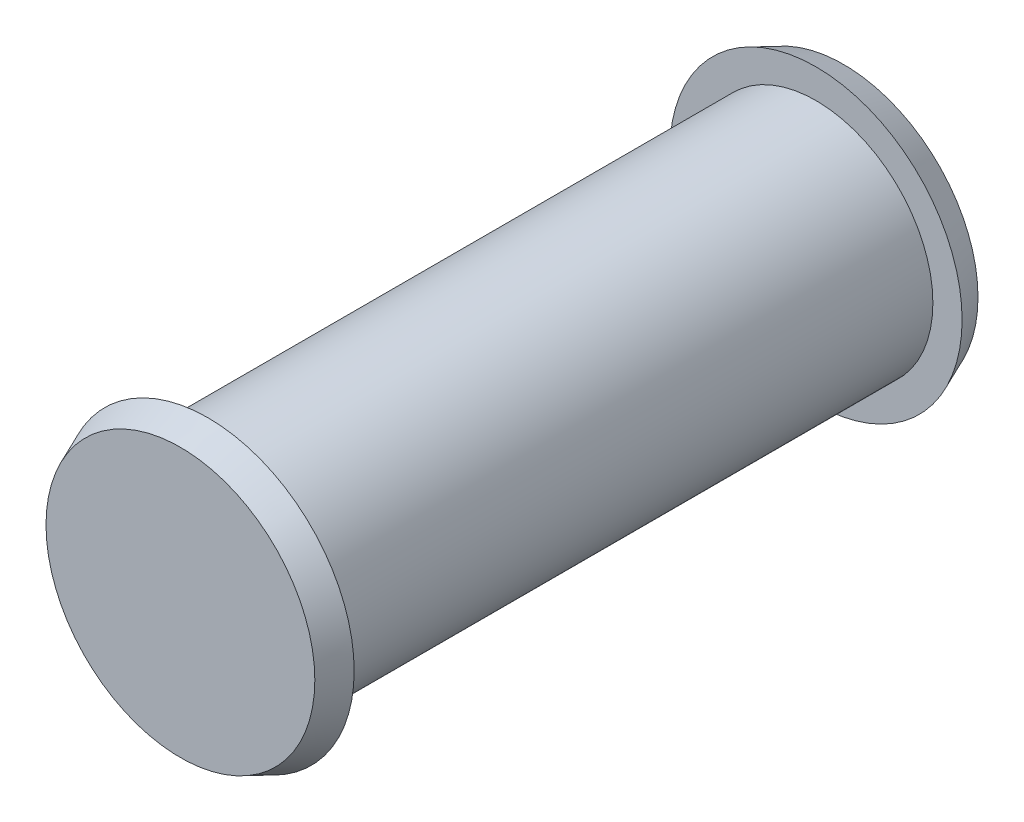
ISO-10303-21;
HEADER;
FILE_DESCRIPTION(('STEP AP214'),'2;1');
FILE_NAME('part.step','',(''),(''),'','','');
FILE_SCHEMA(('AUTOMOTIVE_DESIGN { 1 0 10303 214 1 1 1 1 }'));
ENDSEC;
DATA;
#1=APPLICATION_CONTEXT('core data for automotive mechanical design processes');
#2=APPLICATION_PROTOCOL_DEFINITION('international standard','automotive_design',2000,#1);
#3=PRODUCT_CONTEXT('',#1,'mechanical');
#4=PRODUCT('Part','Part','',(#3));
#5=PRODUCT_RELATED_PRODUCT_CATEGORY('part','',(#4));
#6=PRODUCT_DEFINITION_FORMATION('','',#4);
#7=PRODUCT_DEFINITION_CONTEXT('part definition',#1,'design');
#8=PRODUCT_DEFINITION('design','',#6,#7);
#9=PRODUCT_DEFINITION_SHAPE('','',#8);
#10=(LENGTH_UNIT() NAMED_UNIT(*) SI_UNIT(.MILLI.,.METRE.));
#11=(NAMED_UNIT(*) PLANE_ANGLE_UNIT() SI_UNIT($,.RADIAN.));
#12=(NAMED_UNIT(*) SI_UNIT($,.STERADIAN.) SOLID_ANGLE_UNIT());
#13=UNCERTAINTY_MEASURE_WITH_UNIT(LENGTH_MEASURE(1.E-05),#10,'distance_accuracy_value','');
#14=(GEOMETRIC_REPRESENTATION_CONTEXT(3) GLOBAL_UNCERTAINTY_ASSIGNED_CONTEXT((#13)) GLOBAL_UNIT_ASSIGNED_CONTEXT((#10,
#11,#12)) REPRESENTATION_CONTEXT('',''));
#15=CARTESIAN_POINT('',(0.,0.,0.));
#16=DIRECTION('',(0.,0.,1.));
#17=DIRECTION('',(1.,0.,0.));
#18=AXIS2_PLACEMENT_3D('',#15,#16,#17);
#19=CARTESIAN_POINT('',(-108.082258725157,104.784469074592,-20.3922048969287));
#20=DIRECTION('',(0.,0.,1.));
#21=DIRECTION('',(1.,0.,0.));
#22=AXIS2_PLACEMENT_3D('',#19,#20,#21);
#23=CYLINDRICAL_SURFACE('',#22,2.54000000002594);
#24=CARTESIAN_POINT('',(-108.082258725157,104.784469074592,0.));
#25=DIRECTION('',(0.,0.,1.));
#26=DIRECTION('',(1.,0.,0.));
#27=AXIS2_PLACEMENT_3D('',#24,#25,#26);
#28=CIRCLE('',#27,2.54000000002594);
#29=CARTESIAN_POINT('',(-105.542258725131,104.784469074592,0.));
#30=VERTEX_POINT('',#29);
#31=EDGE_CURVE('E10',#30,#30,#28,.T.);
#32=CARTESIAN_POINT('',(-108.082258725157,104.784469074592,-13.2080000000368));
#33=DIRECTION('',(0.,0.,-1.));
#34=DIRECTION('',(-1.,0.,0.));
#35=AXIS2_PLACEMENT_3D('',#32,#33,#34);
#36=CIRCLE('',#35,2.54000000002594);
#37=CARTESIAN_POINT('',(-105.542258725131,104.784469074592,-13.2080000000368));
#38=VERTEX_POINT('',#37);
#39=EDGE_CURVE('E50',#38,#38,#36,.F.);
#40=CARTESIAN_POINT('',(-105.542258725131,104.784469074592,0.));
#41=CARTESIAN_POINT('',(-105.542258725131,104.784469074592,-0.13758333333372));
#42=CARTESIAN_POINT('',(-105.542258725131,104.784469074592,-0.275166666667436));
#43=CARTESIAN_POINT('',(-105.542258725131,104.784469074592,-0.550333333334868));
#44=CARTESIAN_POINT('',(-105.542258725131,104.784469074592,-0.687916666668584));
#45=CARTESIAN_POINT('',(-105.542258725131,104.784469074592,-0.963083333336017));
#46=CARTESIAN_POINT('',(-105.542258725131,104.784469074592,-1.10066666666973));
#47=CARTESIAN_POINT('',(-105.542258725131,104.784469074592,-1.37583333333717));
#48=CARTESIAN_POINT('',(-105.542258725131,104.784469074592,-1.51341666667088));
#49=CARTESIAN_POINT('',(-105.542258725131,104.784469074592,-1.78858333333832));
#50=CARTESIAN_POINT('',(-105.542258725131,104.784469074592,-1.92616666667203));
#51=CARTESIAN_POINT('',(-105.542258725131,104.784469074592,-2.20133333333946));
#52=CARTESIAN_POINT('',(-105.542258725131,104.784469074592,-2.33891666667318));
#53=CARTESIAN_POINT('',(-105.542258725131,104.784469074592,-2.61408333334061));
#54=CARTESIAN_POINT('',(-105.542258725131,104.784469074592,-2.75166666667433));
#55=CARTESIAN_POINT('',(-105.542258725131,104.784469074592,-3.02683333334176));
#56=CARTESIAN_POINT('',(-105.542258725131,104.784469074592,-3.16441666667548));
#57=CARTESIAN_POINT('',(-105.542258725131,104.784469074592,-3.43958333334291));
#58=CARTESIAN_POINT('',(-105.542258725131,104.784469074592,-3.57716666667663));
#59=CARTESIAN_POINT('',(-105.542258725131,104.784469074592,-3.85233333334406));
#60=CARTESIAN_POINT('',(-105.542258725131,104.784469074592,-3.98991666667778));
#61=CARTESIAN_POINT('',(-105.542258725131,104.784469074592,-4.26508333334521));
#62=CARTESIAN_POINT('',(-105.542258725131,104.784469074592,-4.40266666667893));
#63=CARTESIAN_POINT('',(-105.542258725131,104.784469074592,-4.67783333334636));
#64=CARTESIAN_POINT('',(-105.542258725131,104.784469074592,-4.81541666668008));
#65=CARTESIAN_POINT('',(-105.542258725131,104.784469074592,-5.09058333334751));
#66=CARTESIAN_POINT('',(-105.542258725131,104.784469074592,-5.22816666668122));
#67=CARTESIAN_POINT('',(-105.542258725131,104.784469074592,-5.50333333334866));
#68=CARTESIAN_POINT('',(-105.542258725131,104.784469074592,-5.64091666668237));
#69=CARTESIAN_POINT('',(-105.542258725131,104.784469074592,-5.91608333334981));
#70=CARTESIAN_POINT('',(-105.542258725131,104.784469074592,-6.05366666668352));
#71=CARTESIAN_POINT('',(-105.542258725131,104.784469074592,-6.32883333335096));
#72=CARTESIAN_POINT('',(-105.542258725131,104.784469074592,-6.46641666668467));
#73=CARTESIAN_POINT('',(-105.542258725131,104.784469074592,-6.7415833333521));
#74=CARTESIAN_POINT('',(-105.542258725131,104.784469074592,-6.87916666668582));
#75=CARTESIAN_POINT('',(-105.542258725131,104.784469074592,-7.15433333335325));
#76=CARTESIAN_POINT('',(-105.542258725131,104.784469074592,-7.29191666668697));
#77=CARTESIAN_POINT('',(-105.542258725131,104.784469074592,-7.5670833333544));
#78=CARTESIAN_POINT('',(-105.542258725131,104.784469074592,-7.70466666668812));
#79=CARTESIAN_POINT('',(-105.542258725131,104.784469074592,-7.97983333335555));
#80=CARTESIAN_POINT('',(-105.542258725131,104.784469074592,-8.11741666668927));
#81=CARTESIAN_POINT('',(-105.542258725131,104.784469074592,-8.3925833333567));
#82=CARTESIAN_POINT('',(-105.542258725131,104.784469074592,-8.53016666669042));
#83=CARTESIAN_POINT('',(-105.542258725131,104.784469074592,-8.80533333335785));
#84=CARTESIAN_POINT('',(-105.542258725131,104.784469074592,-8.94291666669156));
#85=CARTESIAN_POINT('',(-105.542258725131,104.784469074592,-9.218083333359));
#86=CARTESIAN_POINT('',(-105.542258725131,104.784469074592,-9.35566666669271));
#87=CARTESIAN_POINT('',(-105.542258725131,104.784469074592,-9.63083333336015));
#88=CARTESIAN_POINT('',(-105.542258725131,104.784469074592,-9.76841666669386));
#89=CARTESIAN_POINT('',(-105.542258725131,104.784469074592,-10.0435833333613));
#90=CARTESIAN_POINT('',(-105.542258725131,104.784469074592,-10.181166666695));
#91=CARTESIAN_POINT('',(-105.542258725131,104.784469074592,-10.4563333333624));
#92=CARTESIAN_POINT('',(-105.542258725131,104.784469074592,-10.5939166666962));
#93=CARTESIAN_POINT('',(-105.542258725131,104.784469074592,-10.8690833333636));
#94=CARTESIAN_POINT('',(-105.542258725131,104.784469074592,-11.0066666666973));
#95=CARTESIAN_POINT('',(-105.542258725131,104.784469074592,-11.2818333333647));
#96=CARTESIAN_POINT('',(-105.542258725131,104.784469074592,-11.4194166666985));
#97=CARTESIAN_POINT('',(-105.542258725131,104.784469074592,-11.6945833333659));
#98=CARTESIAN_POINT('',(-105.542258725131,104.784469074592,-11.8321666666996));
#99=CARTESIAN_POINT('',(-105.542258725131,104.784469074592,-12.107333333367));
#100=CARTESIAN_POINT('',(-105.542258725131,104.784469074592,-12.2449166667008));
#101=CARTESIAN_POINT('',(-105.542258725131,104.784469074592,-12.5200833333682));
#102=CARTESIAN_POINT('',(-105.542258725131,104.784469074592,-12.6576666667019));
#103=CARTESIAN_POINT('',(-105.542258725131,104.784469074592,-12.9328333333693));
#104=CARTESIAN_POINT('',(-105.542258725131,104.784469074592,-13.0704166667031));
#105=CARTESIAN_POINT('',(-105.542258725131,104.784469074592,-13.2080000000368));
#106=B_SPLINE_CURVE_WITH_KNOTS('',3,(#40,#41,#42,#43,#44,#45,#46,#47,#48,#49,#50,#51,#52,#53,
#54,#55,#56,#57,#58,#59,#60,#61,#62,#63,#64,#65,#66,#67,#68,#69,#70,#71,#72,#73,#74,#75,#76,#77,
#78,#79,#80,#81,#82,#83,#84,#85,#86,#87,#88,#89,#90,#91,#92,#93,#94,#95,#96,#97,#98,#99,#100,
#101,#102,#103,#104,#105),.UNSPECIFIED.,.F.,.F.,(4,2,2,2,2,2,2,2,2,2,2,2,2,2,2,2,2,2,2,2,2,2,2,
2,2,2,2,2,2,2,2,2,4),(0.,0.412750000001148,0.825500000002297,1.23825000000345,1.6510000000046,
2.06375000000574,2.47650000000689,2.88925000000805,3.30200000000919,3.71475000001034,
4.12750000001149,4.54025000001264,4.95300000001379,5.36575000001494,5.77850000001609,
6.19125000001724,6.60400000001839,7.01675000001953,7.42950000002068,7.84225000002183,
8.25500000002298,8.66775000002413,9.08050000002528,9.49325000002643,9.90600000002758,
10.3187500000287,10.7315000000299,11.144250000031,11.5570000000322,11.9697500000333,
12.3825000000345,12.7952500000356,13.2080000000368),.UNSPECIFIED.);
#107=EDGE_CURVE('BSEAM36',#30,#38,#106,.T.);
#108=ORIENTED_EDGE('',*,*,#31,.F.);
#109=ORIENTED_EDGE('',*,*,#39,.T.);
#110=ORIENTED_EDGE('',*,*,#107,.T.);
#111=ORIENTED_EDGE('',*,*,#107,.F.);
#112=EDGE_LOOP('',(#108,#110,#109,#111));
#113=FACE_BOUND('',#112,.T.);
#114=ADVANCED_FACE('F36',(#113),#23,.T.);
#115=CARTESIAN_POINT('',(-108.082258725157,104.784469074592,0.));
#116=DIRECTION('',(0.,0.,-1.));
#117=DIRECTION('',(1.,0.,0.));
#118=AXIS2_PLACEMENT_3D('',#115,#116,#117);
#119=CONICAL_SURFACE('',#118,3.175,0.401425727958696);
#120=CARTESIAN_POINT('',(-108.082258725157,104.784469074592,0.6));
#121=DIRECTION('',(0.,0.,1.));
#122=DIRECTION('',(1.,0.,0.));
#123=AXIS2_PLACEMENT_3D('',#120,#121,#122);
#124=CIRCLE('',#123,2.92031511027423);
#125=CARTESIAN_POINT('',(-105.161943614883,104.784469074592,0.6));
#126=VERTEX_POINT('',#125);
#127=EDGE_CURVE('E42',#126,#126,#124,.T.);
#128=ORIENTED_EDGE('',*,*,#127,.F.);
#129=EDGE_LOOP('',(#128));
#130=FACE_BOUND('',#129,.T.);
#131=CARTESIAN_POINT('',(-108.082258725157,104.784469074592,0.));
#132=DIRECTION('',(0.,0.,1.));
#133=DIRECTION('',(1.,0.,0.));
#134=AXIS2_PLACEMENT_3D('',#131,#132,#133);
#135=CIRCLE('',#134,3.175);
#136=CARTESIAN_POINT('',(-104.907258725157,104.784469074592,0.));
#137=VERTEX_POINT('',#136);
#138=EDGE_CURVE('E46',#137,#137,#135,.T.);
#139=ORIENTED_EDGE('',*,*,#138,.T.);
#140=EDGE_LOOP('',(#139));
#141=FACE_BOUND('',#140,.T.);
#142=ADVANCED_FACE('F76',(#130,#141),#119,.T.);
#143=CARTESIAN_POINT('',(-108.082258725157,104.784469074592,0.6));
#144=DIRECTION('',(0.,0.,1.));
#145=DIRECTION('',(1.,0.,0.));
#146=AXIS2_PLACEMENT_3D('',#143,#144,#145);
#147=PLANE('',#146);
#148=ORIENTED_EDGE('',*,*,#127,.T.);
#149=EDGE_LOOP('',(#148));
#150=FACE_BOUND('',#149,.T.);
#151=ADVANCED_FACE('F81',(#150),#147,.T.);
#152=CARTESIAN_POINT('',(-108.082258725157,104.784469074592,0.));
#153=DIRECTION('',(0.,0.,1.));
#154=DIRECTION('',(1.,0.,0.));
#155=AXIS2_PLACEMENT_3D('',#152,#153,#154);
#156=PLANE('',#155);
#157=ORIENTED_EDGE('',*,*,#31,.T.);
#158=EDGE_LOOP('',(#157));
#159=FACE_BOUND('',#158,.T.);
#160=ORIENTED_EDGE('',*,*,#138,.F.);
#161=EDGE_LOOP('',(#160));
#162=FACE_BOUND('',#161,.T.);
#163=ADVANCED_FACE('F87',(#159,#162),#156,.F.);
#164=CARTESIAN_POINT('',(-108.082258725157,104.784469074592,-13.2080000000368));
#165=DIRECTION('',(0.,0.,1.));
#166=DIRECTION('',(-1.,0.,0.));
#167=AXIS2_PLACEMENT_3D('',#164,#165,#166);
#168=CONICAL_SURFACE('',#167,3.175,0.401425727958696);
#169=CARTESIAN_POINT('',(-108.082258725157,104.784469074592,-13.8080000000368));
#170=DIRECTION('',(0.,0.,-1.));
#171=DIRECTION('',(-1.,0.,0.));
#172=AXIS2_PLACEMENT_3D('',#169,#170,#171);
#173=CIRCLE('',#172,2.92031511027423);
#174=CARTESIAN_POINT('',(-111.002573835431,104.784469074592,-13.8080000000368));
#175=VERTEX_POINT('',#174);
#176=EDGE_CURVE('E55',#175,#175,#173,.T.);
#177=ORIENTED_EDGE('',*,*,#176,.F.);
#178=EDGE_LOOP('',(#177));
#179=FACE_BOUND('',#178,.T.);
#180=CARTESIAN_POINT('',(-108.082258725157,104.784469074592,-13.2080000000368));
#181=DIRECTION('',(0.,0.,-1.));
#182=DIRECTION('',(-1.,0.,0.));
#183=AXIS2_PLACEMENT_3D('',#180,#181,#182);
#184=CIRCLE('',#183,3.175);
#185=CARTESIAN_POINT('',(-111.257258725157,104.784469074592,-13.2080000000368));
#186=VERTEX_POINT('',#185);
#187=EDGE_CURVE('E58',#186,#186,#184,.T.);
#188=ORIENTED_EDGE('',*,*,#187,.T.);
#189=EDGE_LOOP('',(#188));
#190=FACE_BOUND('',#189,.T.);
#191=ADVANCED_FACE('F62',(#179,#190),#168,.T.);
#192=CARTESIAN_POINT('',(-108.082258725157,104.784469074592,-13.8080000000368));
#193=DIRECTION('',(0.,0.,-1.));
#194=DIRECTION('',(-1.,0.,0.));
#195=AXIS2_PLACEMENT_3D('',#192,#193,#194);
#196=PLANE('',#195);
#197=ORIENTED_EDGE('',*,*,#176,.T.);
#198=EDGE_LOOP('',(#197));
#199=FACE_BOUND('',#198,.T.);
#200=ADVANCED_FACE('F66',(#199),#196,.T.);
#201=CARTESIAN_POINT('',(-108.082258725157,104.784469074592,-13.2080000000368));
#202=DIRECTION('',(0.,0.,-1.));
#203=DIRECTION('',(-1.,0.,0.));
#204=AXIS2_PLACEMENT_3D('',#201,#202,#203);
#205=PLANE('',#204);
#206=ORIENTED_EDGE('',*,*,#39,.F.);
#207=EDGE_LOOP('',(#206));
#208=FACE_BOUND('',#207,.T.);
#209=ORIENTED_EDGE('',*,*,#187,.F.);
#210=EDGE_LOOP('',(#209));
#211=FACE_BOUND('',#210,.T.);
#212=ADVANCED_FACE('F64',(#208,#211),#205,.F.);
#213=CLOSED_SHELL('',(#114,#142,#151,#163,#191,#200,#212));
#214=MANIFOLD_SOLID_BREP('B2',#213);
#215=ADVANCED_BREP_SHAPE_REPRESENTATION('',(#18,#214),#14);
#216=SHAPE_DEFINITION_REPRESENTATION(#9,#215);
ENDSEC;
END-ISO-10303-21;
